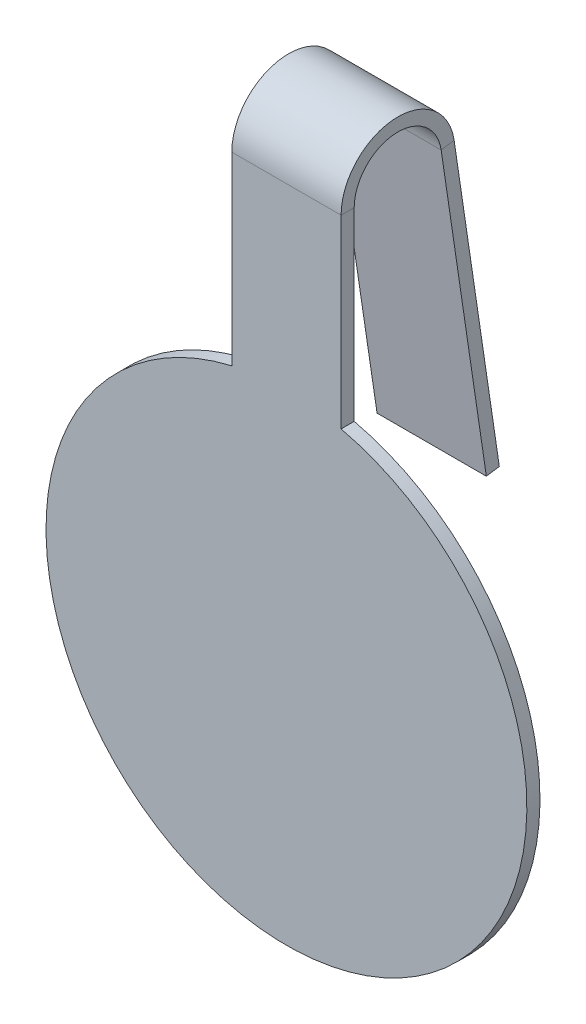
ISO-10303-21;
HEADER;
FILE_DESCRIPTION(('STEP AP214'),'2;1');
FILE_NAME('part.step','',(''),(''),'','','');
FILE_SCHEMA(('AUTOMOTIVE_DESIGN { 1 0 10303 214 1 1 1 1 }'));
ENDSEC;
DATA;
#1=APPLICATION_CONTEXT('core data for automotive mechanical design processes');
#2=APPLICATION_PROTOCOL_DEFINITION('international standard','automotive_design',2000,#1);
#3=PRODUCT_CONTEXT('',#1,'mechanical');
#4=PRODUCT('Part','Part','',(#3));
#5=PRODUCT_RELATED_PRODUCT_CATEGORY('part','',(#4));
#6=PRODUCT_DEFINITION_FORMATION('','',#4);
#7=PRODUCT_DEFINITION_CONTEXT('part definition',#1,'design');
#8=PRODUCT_DEFINITION('design','',#6,#7);
#9=PRODUCT_DEFINITION_SHAPE('','',#8);
#10=(LENGTH_UNIT() NAMED_UNIT(*) SI_UNIT(.MILLI.,.METRE.));
#11=(NAMED_UNIT(*) PLANE_ANGLE_UNIT() SI_UNIT($,.RADIAN.));
#12=(NAMED_UNIT(*) SI_UNIT($,.STERADIAN.) SOLID_ANGLE_UNIT());
#13=UNCERTAINTY_MEASURE_WITH_UNIT(LENGTH_MEASURE(1.E-05),#10,'distance_accuracy_value','');
#14=(GEOMETRIC_REPRESENTATION_CONTEXT(3) GLOBAL_UNCERTAINTY_ASSIGNED_CONTEXT((#13)) GLOBAL_UNIT_ASSIGNED_CONTEXT((#10,
#11,#12)) REPRESENTATION_CONTEXT('',''));
#15=CARTESIAN_POINT('',(0.,0.,0.));
#16=DIRECTION('',(0.,0.,1.));
#17=DIRECTION('',(1.,0.,0.));
#18=AXIS2_PLACEMENT_3D('',#15,#16,#17);
#19=CARTESIAN_POINT('',(0.,286.264732514669,-1.17231105057405));
#20=DIRECTION('',(0.,0.146548661089463,-0.989203462353871));
#21=DIRECTION('',(1.,0.,0.));
#22=AXIS2_PLACEMENT_3D('',#19,#20,#21);
#23=PLANE('',#22);
#24=DIRECTION('',(0.,-0.989203462353871,-0.146548661089463));
#25=VECTOR('',#24,1.);
#26=CARTESIAN_POINT('',(15.875,218.977029958642,-11.140859577393));
#27=LINE('',#26,#25);
#28=CARTESIAN_POINT('',(15.875,123.653365295759,-25.2628839718942));
#29=VERTEX_POINT('',#28);
#30=CARTESIAN_POINT('',(15.875,35.007053076786,-38.3956709672977));
#31=VERTEX_POINT('',#30);
#32=EDGE_CURVE('E55',#29,#31,#27,.T.);
#33=ORIENTED_EDGE('',*,*,#32,.F.);
#34=DIRECTION('',(-1.,0.,0.));
#35=VECTOR('',#34,1.);
#36=CARTESIAN_POINT('',(0.,123.653365295759,-25.2628839718942));
#37=LINE('',#36,#35);
#38=CARTESIAN_POINT('',(-15.875,123.653365295759,-25.2628839718942));
#39=VERTEX_POINT('',#38);
#40=EDGE_CURVE('E47',#29,#39,#37,.T.);
#41=ORIENTED_EDGE('',*,*,#40,.T.);
#42=DIRECTION('',(0.,0.989203462353871,0.146548661089463));
#43=VECTOR('',#42,1.);
#44=CARTESIAN_POINT('',(-15.875,218.977029958642,-11.140859577393));
#45=LINE('',#44,#43);
#46=CARTESIAN_POINT('',(-15.875,35.007053076786,-38.3956709672977));
#47=VERTEX_POINT('',#46);
#48=EDGE_CURVE('E62',#47,#39,#45,.T.);
#49=ORIENTED_EDGE('',*,*,#48,.F.);
#50=DIRECTION('',(-1.,0.,0.));
#51=VECTOR('',#50,1.);
#52=CARTESIAN_POINT('',(15.875,35.007053076786,-38.3956709672977));
#53=LINE('',#52,#51);
#54=EDGE_CURVE('E169',#31,#47,#53,.T.);
#55=ORIENTED_EDGE('',*,*,#54,.F.);
#56=EDGE_LOOP('',(#33,#41,#49,#55));
#57=FACE_BOUND('',#56,.T.);
#58=ADVANCED_FACE('F38',(#57),#23,.F.);
#59=CARTESIAN_POINT('',(-15.875,219.535380357392,-14.9097247689613));
#60=DIRECTION('',(1.,0.,0.));
#61=DIRECTION('',(0.,-0.146548661089463,0.989203462353871));
#62=AXIS2_PLACEMENT_3D('',#59,#60,#61);
#63=PLANE('',#62);
#64=ORIENTED_EDGE('',*,*,#48,.T.);
#65=DIRECTION('',(0.,0.14654866108947,-0.98920346235387));
#66=VECTOR('',#65,1.);
#67=CARTESIAN_POINT('',(-15.875,124.21171569451,-29.0317491634631));
#68=LINE('',#67,#66);
#69=CARTESIAN_POINT('',(-15.875,124.21171569451,-29.0317491634624));
#70=VERTEX_POINT('',#69);
#71=EDGE_CURVE('E177',#39,#70,#68,.T.);
#72=ORIENTED_EDGE('',*,*,#71,.T.);
#73=DIRECTION('',(0.,0.989203462353871,0.146548661089463));
#74=VECTOR('',#73,1.);
#75=CARTESIAN_POINT('',(-15.875,219.535380357392,-14.9097247689613));
#76=LINE('',#75,#74);
#77=CARTESIAN_POINT('',(-15.875,35.5654034755369,-42.1645361588659));
#78=VERTEX_POINT('',#77);
#79=EDGE_CURVE('E168',#78,#70,#76,.T.);
#80=ORIENTED_EDGE('',*,*,#79,.F.);
#81=DIRECTION('',(0.,-0.146548661089463,0.989203462353871));
#82=VECTOR('',#81,1.);
#83=CARTESIAN_POINT('',(-15.875,35.5654034755369,-42.1645361588659));
#84=LINE('',#83,#82);
#85=EDGE_CURVE('E171',#78,#47,#84,.T.);
#86=ORIENTED_EDGE('',*,*,#85,.T.);
#87=EDGE_LOOP('',(#64,#72,#80,#86));
#88=FACE_BOUND('',#87,.T.);
#89=ADVANCED_FACE('F188',(#88),#63,.F.);
#90=CARTESIAN_POINT('',(15.875,219.535380357392,-14.9097247689613));
#91=DIRECTION('',(-1.,0.,0.));
#92=DIRECTION('',(0.,0.146548661089463,-0.989203462353871));
#93=AXIS2_PLACEMENT_3D('',#90,#91,#92);
#94=PLANE('',#93);
#95=DIRECTION('',(0.,-0.989203462353871,-0.146548661089463));
#96=VECTOR('',#95,1.);
#97=CARTESIAN_POINT('',(15.875,219.535380357392,-14.9097247689613));
#98=LINE('',#97,#96);
#99=CARTESIAN_POINT('',(15.875,124.21171569451,-29.0317491634624));
#100=VERTEX_POINT('',#99);
#101=CARTESIAN_POINT('',(15.875,35.5654034755369,-42.1645361588659));
#102=VERTEX_POINT('',#101);
#103=EDGE_CURVE('E42',#100,#102,#98,.T.);
#104=ORIENTED_EDGE('',*,*,#103,.F.);
#105=DIRECTION('',(0.,-0.14654866108947,0.98920346235387));
#106=VECTOR('',#105,1.);
#107=CARTESIAN_POINT('',(15.875,124.21171569451,-29.0317491634631));
#108=LINE('',#107,#106);
#109=EDGE_CURVE('E12',#100,#29,#108,.T.);
#110=ORIENTED_EDGE('',*,*,#109,.T.);
#111=ORIENTED_EDGE('',*,*,#32,.T.);
#112=DIRECTION('',(0.,-0.146548661089463,0.989203462353871));
#113=VECTOR('',#112,1.);
#114=CARTESIAN_POINT('',(15.875,35.5654034755369,-42.1645361588659));
#115=LINE('',#114,#113);
#116=EDGE_CURVE('E173',#102,#31,#115,.T.);
#117=ORIENTED_EDGE('',*,*,#116,.F.);
#118=EDGE_LOOP('',(#104,#110,#111,#117));
#119=FACE_BOUND('',#118,.T.);
#120=ADVANCED_FACE('F40',(#119),#94,.F.);
#121=CARTESIAN_POINT('',(15.875,35.5654034755369,-42.1645361588659));
#122=DIRECTION('',(0.,0.989203462353871,0.146548661089463));
#123=DIRECTION('',(0.,-0.146548661089463,0.989203462353871));
#124=AXIS2_PLACEMENT_3D('',#121,#122,#123);
#125=PLANE('',#124);
#126=ORIENTED_EDGE('',*,*,#54,.T.);
#127=ORIENTED_EDGE('',*,*,#85,.F.);
#128=DIRECTION('',(-1.,0.,0.));
#129=VECTOR('',#128,1.);
#130=CARTESIAN_POINT('',(15.875,35.5654034755369,-42.1645361588659));
#131=LINE('',#130,#129);
#132=EDGE_CURVE('E166',#102,#78,#131,.T.);
#133=ORIENTED_EDGE('',*,*,#132,.F.);
#134=ORIENTED_EDGE('',*,*,#116,.T.);
#135=EDGE_LOOP('',(#126,#127,#133,#134));
#136=FACE_BOUND('',#135,.T.);
#137=ADVANCED_FACE('F212',(#136),#125,.F.);
#138=CARTESIAN_POINT('',(0.,286.82308291342,-4.9411762421423));
#139=DIRECTION('',(0.,0.146548661089463,-0.989203462353871));
#140=DIRECTION('',(1.,0.,0.));
#141=AXIS2_PLACEMENT_3D('',#138,#139,#140);
#142=PLANE('',#141);
#143=DIRECTION('',(-1.,0.,0.));
#144=VECTOR('',#143,1.);
#145=CARTESIAN_POINT('',(0.,124.21171569451,-29.0317491634624));
#146=LINE('',#145,#144);
#147=EDGE_CURVE('E141',#100,#70,#146,.T.);
#148=ORIENTED_EDGE('',*,*,#147,.F.);
#149=ORIENTED_EDGE('',*,*,#103,.T.);
#150=ORIENTED_EDGE('',*,*,#132,.T.);
#151=ORIENTED_EDGE('',*,*,#79,.T.);
#152=EDGE_LOOP('',(#148,#149,#150,#151));
#153=FACE_BOUND('',#152,.T.);
#154=ADVANCED_FACE('F184',(#153),#142,.T.);
#155=CARTESIAN_POINT('',(0.,0.,3.81));
#156=DIRECTION('',(0.,0.,-1.));
#157=DIRECTION('',(-1.,0.,0.));
#158=AXIS2_PLACEMENT_3D('',#155,#156,#157);
#159=CYLINDRICAL_SURFACE('',#158,69.85);
#160=CARTESIAN_POINT('',(0.,0.,0.));
#161=DIRECTION('',(0.,0.,1.));
#162=DIRECTION('',(1.,0.,0.));
#163=AXIS2_PLACEMENT_3D('',#160,#161,#162);
#164=CIRCLE('',#163,69.85);
#165=CARTESIAN_POINT('',(-15.875,68.0221057818706,0.));
#166=VERTEX_POINT('',#165);
#167=CARTESIAN_POINT('',(15.875,68.0221057818706,0.));
#168=VERTEX_POINT('',#167);
#169=EDGE_CURVE('E136',#166,#168,#164,.T.);
#170=ORIENTED_EDGE('',*,*,#169,.T.);
#171=DIRECTION('',(0.,0.,-1.));
#172=VECTOR('',#171,1.);
#173=CARTESIAN_POINT('',(15.875,68.0221057818706,3.81));
#174=LINE('',#173,#172);
#175=CARTESIAN_POINT('',(15.875,68.0221057818706,3.81));
#176=VERTEX_POINT('',#175);
#177=EDGE_CURVE('E155',#176,#168,#174,.T.);
#178=ORIENTED_EDGE('',*,*,#177,.F.);
#179=CARTESIAN_POINT('',(0.,0.,3.81));
#180=DIRECTION('',(0.,0.,1.));
#181=DIRECTION('',(1.,0.,0.));
#182=AXIS2_PLACEMENT_3D('',#179,#180,#181);
#183=CIRCLE('',#182,69.85);
#184=CARTESIAN_POINT('',(-15.875,68.0221057818706,3.81));
#185=VERTEX_POINT('',#184);
#186=EDGE_CURVE('E116',#185,#176,#183,.T.);
#187=ORIENTED_EDGE('',*,*,#186,.F.);
#188=DIRECTION('',(0.,0.,-1.));
#189=VECTOR('',#188,1.);
#190=CARTESIAN_POINT('',(-15.875,68.0221057818706,3.81));
#191=LINE('',#190,#189);
#192=EDGE_CURVE('E112',#185,#166,#191,.T.);
#193=ORIENTED_EDGE('',*,*,#192,.T.);
#194=EDGE_LOOP('',(#170,#178,#187,#193));
#195=FACE_BOUND('',#194,.T.);
#196=ADVANCED_FACE('F204',(#195),#159,.T.);
#197=CARTESIAN_POINT('',(0.,0.,3.81));
#198=DIRECTION('',(0.,0.,1.));
#199=DIRECTION('',(1.,0.,0.));
#200=AXIS2_PLACEMENT_3D('',#197,#198,#199);
#201=PLANE('',#200);
#202=DIRECTION('',(0.,1.,0.));
#203=VECTOR('',#202,1.);
#204=CARTESIAN_POINT('',(15.875,68.0221057818706,3.81));
#205=LINE('',#204,#203);
#206=CARTESIAN_POINT('',(15.875,121.792197299923,3.81));
#207=VERTEX_POINT('',#206);
#208=EDGE_CURVE('E121',#176,#207,#205,.T.);
#209=ORIENTED_EDGE('',*,*,#208,.T.);
#210=DIRECTION('',(-1.,0.,0.));
#211=VECTOR('',#210,1.);
#212=CARTESIAN_POINT('',(0.,121.792197299923,3.81));
#213=LINE('',#212,#211);
#214=CARTESIAN_POINT('',(-15.875,121.792197299923,3.81));
#215=VERTEX_POINT('',#214);
#216=EDGE_CURVE('E117',#207,#215,#213,.T.);
#217=ORIENTED_EDGE('',*,*,#216,.T.);
#218=DIRECTION('',(0.,-1.,0.));
#219=VECTOR('',#218,1.);
#220=CARTESIAN_POINT('',(-15.875,68.0221057818706,3.81));
#221=LINE('',#220,#219);
#222=EDGE_CURVE('E105',#215,#185,#221,.T.);
#223=ORIENTED_EDGE('',*,*,#222,.T.);
#224=ORIENTED_EDGE('',*,*,#186,.T.);
#225=EDGE_LOOP('',(#209,#217,#223,#224));
#226=FACE_BOUND('',#225,.T.);
#227=ADVANCED_FACE('F120',(#226),#201,.T.);
#228=CARTESIAN_POINT('',(-15.875,68.0221057818706,3.81));
#229=DIRECTION('',(1.,0.,0.));
#230=DIRECTION('',(0.,0.,-1.));
#231=AXIS2_PLACEMENT_3D('',#228,#229,#230);
#232=PLANE('',#231);
#233=DIRECTION('',(0.,0.,1.));
#234=VECTOR('',#233,1.);
#235=CARTESIAN_POINT('',(-15.875,121.792197299923,3.81000000000038));
#236=LINE('',#235,#234);
#237=CARTESIAN_POINT('',(-15.875,121.792197299923,0.));
#238=VERTEX_POINT('',#237);
#239=EDGE_CURVE('E109',#238,#215,#236,.T.);
#240=ORIENTED_EDGE('',*,*,#239,.F.);
#241=DIRECTION('',(0.,-1.,0.));
#242=VECTOR('',#241,1.);
#243=CARTESIAN_POINT('',(-15.875,68.0221057818706,0.));
#244=LINE('',#243,#242);
#245=EDGE_CURVE('E158',#238,#166,#244,.T.);
#246=ORIENTED_EDGE('',*,*,#245,.T.);
#247=ORIENTED_EDGE('',*,*,#192,.F.);
#248=ORIENTED_EDGE('',*,*,#222,.F.);
#249=EDGE_LOOP('',(#240,#246,#247,#248));
#250=FACE_BOUND('',#249,.T.);
#251=ADVANCED_FACE('F107',(#250),#232,.F.);
#252=CARTESIAN_POINT('',(0.,0.,0.));
#253=DIRECTION('',(0.,0.,1.));
#254=DIRECTION('',(1.,0.,0.));
#255=AXIS2_PLACEMENT_3D('',#252,#253,#254);
#256=PLANE('',#255);
#257=DIRECTION('',(-1.,0.,0.));
#258=VECTOR('',#257,1.);
#259=CARTESIAN_POINT('',(0.,121.792197299923,0.));
#260=LINE('',#259,#258);
#261=CARTESIAN_POINT('',(15.875,121.792197299923,0.));
#262=VERTEX_POINT('',#261);
#263=EDGE_CURVE('E137',#262,#238,#260,.T.);
#264=ORIENTED_EDGE('',*,*,#263,.F.);
#265=DIRECTION('',(0.,1.,0.));
#266=VECTOR('',#265,1.);
#267=CARTESIAN_POINT('',(15.875,68.0221057818706,0.));
#268=LINE('',#267,#266);
#269=EDGE_CURVE('E153',#168,#262,#268,.T.);
#270=ORIENTED_EDGE('',*,*,#269,.F.);
#271=ORIENTED_EDGE('',*,*,#169,.F.);
#272=ORIENTED_EDGE('',*,*,#245,.F.);
#273=EDGE_LOOP('',(#264,#270,#271,#272));
#274=FACE_BOUND('',#273,.T.);
#275=ADVANCED_FACE('F195',(#274),#256,.F.);
#276=CARTESIAN_POINT('',(15.875,68.0221057818706,3.81));
#277=DIRECTION('',(-1.,0.,0.));
#278=DIRECTION('',(0.,0.,1.));
#279=AXIS2_PLACEMENT_3D('',#276,#277,#278);
#280=PLANE('',#279);
#281=DIRECTION('',(0.,0.,-1.));
#282=VECTOR('',#281,1.);
#283=CARTESIAN_POINT('',(15.875,121.792197299923,3.81000000000038));
#284=LINE('',#283,#282);
#285=EDGE_CURVE('E142',#207,#262,#284,.T.);
#286=ORIENTED_EDGE('',*,*,#285,.F.);
#287=ORIENTED_EDGE('',*,*,#208,.F.);
#288=ORIENTED_EDGE('',*,*,#177,.T.);
#289=ORIENTED_EDGE('',*,*,#269,.T.);
#290=EDGE_LOOP('',(#286,#287,#288,#289));
#291=FACE_BOUND('',#290,.T.);
#292=ADVANCED_FACE('F201',(#291),#280,.F.);
#293=CARTESIAN_POINT('',(15.875,121.792197299923,-12.7));
#294=DIRECTION('',(1.,0.,0.));
#295=DIRECTION('',(0.,0.,-1.));
#296=AXIS2_PLACEMENT_3D('',#293,#294,#295);
#297=PLANE('',#296);
#298=ORIENTED_EDGE('',*,*,#285,.T.);
#299=CARTESIAN_POINT('',(15.875,121.792197299923,-12.7));
#300=DIRECTION('',(-1.,0.,0.));
#301=DIRECTION('',(0.,0.,1.));
#302=AXIS2_PLACEMENT_3D('',#299,#300,#301);
#303=CIRCLE('',#302,12.7);
#304=EDGE_CURVE('E149',#262,#29,#303,.T.);
#305=ORIENTED_EDGE('',*,*,#304,.T.);
#306=ORIENTED_EDGE('',*,*,#109,.F.);
#307=CARTESIAN_POINT('',(15.875,121.792197299923,-12.7));
#308=DIRECTION('',(-1.,0.,0.));
#309=DIRECTION('',(0.,0.,1.));
#310=AXIS2_PLACEMENT_3D('',#307,#308,#309);
#311=CIRCLE('',#310,16.51);
#312=EDGE_CURVE('E143',#207,#100,#311,.T.);
#313=ORIENTED_EDGE('',*,*,#312,.F.);
#314=EDGE_LOOP('',(#298,#305,#306,#313));
#315=FACE_BOUND('',#314,.T.);
#316=ADVANCED_FACE('F198',(#315),#297,.T.);
#317=CARTESIAN_POINT('',(-15.875,121.792197299923,-12.7));
#318=DIRECTION('',(-1.,0.,0.));
#319=DIRECTION('',(0.,0.,1.));
#320=AXIS2_PLACEMENT_3D('',#317,#318,#319);
#321=PLANE('',#320);
#322=CARTESIAN_POINT('',(-15.875,121.792197299923,-12.7));
#323=DIRECTION('',(-1.,0.,0.));
#324=DIRECTION('',(0.,0.,1.));
#325=AXIS2_PLACEMENT_3D('',#322,#323,#324);
#326=CIRCLE('',#325,12.7);
#327=EDGE_CURVE('E135',#39,#238,#326,.F.);
#328=ORIENTED_EDGE('',*,*,#327,.T.);
#329=ORIENTED_EDGE('',*,*,#239,.T.);
#330=CARTESIAN_POINT('',(-15.875,121.792197299923,-12.7));
#331=DIRECTION('',(1.,0.,0.));
#332=DIRECTION('',(0.,0.,-1.));
#333=AXIS2_PLACEMENT_3D('',#330,#331,#332);
#334=CIRCLE('',#333,16.51);
#335=EDGE_CURVE('E133',#70,#215,#334,.T.);
#336=ORIENTED_EDGE('',*,*,#335,.F.);
#337=ORIENTED_EDGE('',*,*,#71,.F.);
#338=EDGE_LOOP('',(#328,#329,#336,#337));
#339=FACE_BOUND('',#338,.T.);
#340=ADVANCED_FACE('F131',(#339),#321,.T.);
#341=CARTESIAN_POINT('',(53.2618531194439,121.792197299923,-12.7));
#342=DIRECTION('',(-1.,0.,0.));
#343=DIRECTION('',(0.,0.,1.));
#344=AXIS2_PLACEMENT_3D('',#341,#342,#343);
#345=CYLINDRICAL_SURFACE('',#344,16.51);
#346=ORIENTED_EDGE('',*,*,#147,.T.);
#347=ORIENTED_EDGE('',*,*,#335,.T.);
#348=ORIENTED_EDGE('',*,*,#216,.F.);
#349=ORIENTED_EDGE('',*,*,#312,.T.);
#350=EDGE_LOOP('',(#346,#347,#348,#349));
#351=FACE_BOUND('',#350,.T.);
#352=ADVANCED_FACE('F140',(#351),#345,.T.);
#353=CARTESIAN_POINT('',(53.2618531194439,121.792197299923,-12.7));
#354=DIRECTION('',(-1.,0.,0.));
#355=DIRECTION('',(0.,0.,1.));
#356=AXIS2_PLACEMENT_3D('',#353,#354,#355);
#357=CYLINDRICAL_SURFACE('',#356,12.7);
#358=ORIENTED_EDGE('',*,*,#40,.F.);
#359=ORIENTED_EDGE('',*,*,#304,.F.);
#360=ORIENTED_EDGE('',*,*,#263,.T.);
#361=ORIENTED_EDGE('',*,*,#327,.F.);
#362=EDGE_LOOP('',(#358,#359,#360,#361));
#363=FACE_BOUND('',#362,.T.);
#364=ADVANCED_FACE('F191',(#363),#357,.F.);
#365=CLOSED_SHELL('',(#58,#89,#120,#137,#154,#196,#227,#251,#275,#292,#316,#340,#352,#364));
#366=MANIFOLD_SOLID_BREP('B2',#365);
#367=ADVANCED_BREP_SHAPE_REPRESENTATION('',(#18,#366),#14);
#368=SHAPE_DEFINITION_REPRESENTATION(#9,#367);
ENDSEC;
END-ISO-10303-21;
